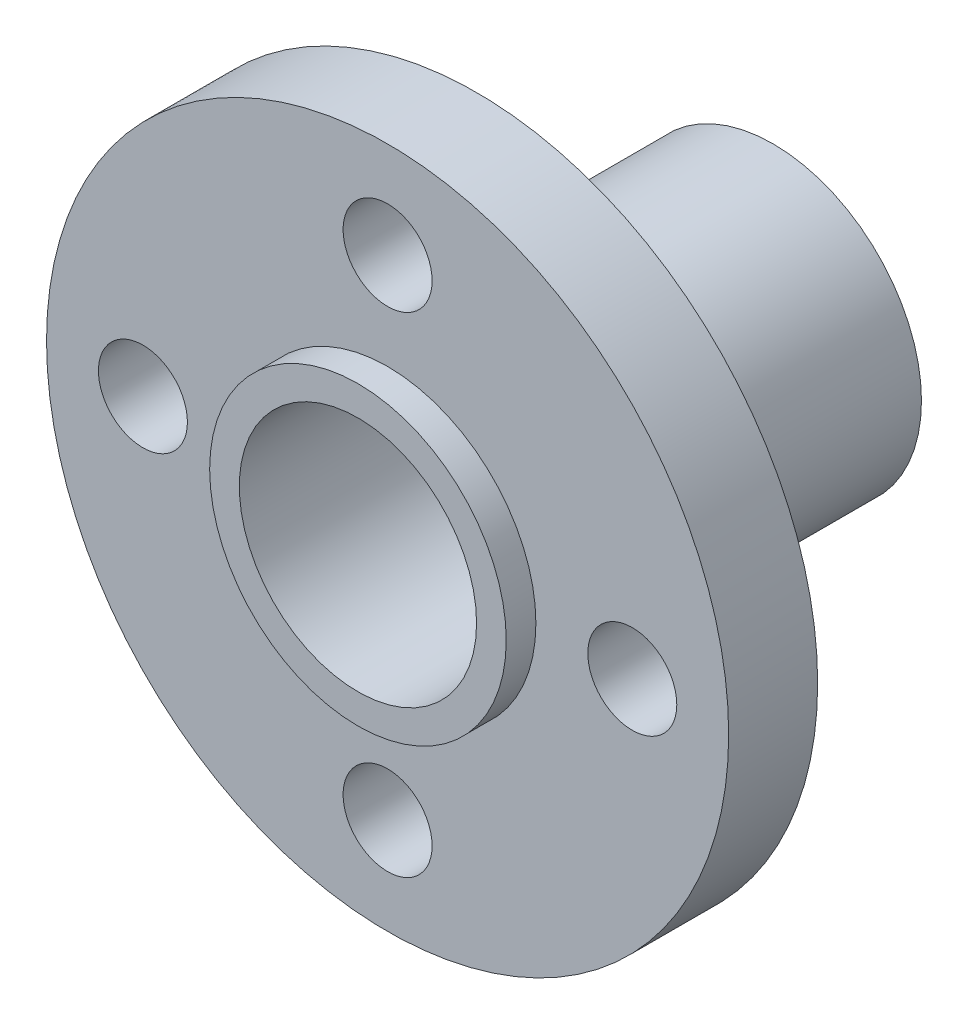
ISO-10303-21;
HEADER;
FILE_DESCRIPTION(('STEP AP214'),'2;1');
FILE_NAME('part.step','',(''),(''),'','','');
FILE_SCHEMA(('AUTOMOTIVE_DESIGN { 1 0 10303 214 1 1 1 1 }'));
ENDSEC;
DATA;
#1=APPLICATION_CONTEXT('core data for automotive mechanical design processes');
#2=APPLICATION_PROTOCOL_DEFINITION('international standard','automotive_design',2000,#1);
#3=PRODUCT_CONTEXT('',#1,'mechanical');
#4=PRODUCT('Part','Part','',(#3));
#5=PRODUCT_RELATED_PRODUCT_CATEGORY('part','',(#4));
#6=PRODUCT_DEFINITION_FORMATION('','',#4);
#7=PRODUCT_DEFINITION_CONTEXT('part definition',#1,'design');
#8=PRODUCT_DEFINITION('design','',#6,#7);
#9=PRODUCT_DEFINITION_SHAPE('','',#8);
#10=(LENGTH_UNIT() NAMED_UNIT(*) SI_UNIT(.MILLI.,.METRE.));
#11=(NAMED_UNIT(*) PLANE_ANGLE_UNIT() SI_UNIT($,.RADIAN.));
#12=(NAMED_UNIT(*) SI_UNIT($,.STERADIAN.) SOLID_ANGLE_UNIT());
#13=UNCERTAINTY_MEASURE_WITH_UNIT(LENGTH_MEASURE(1.E-05),#10,'distance_accuracy_value','');
#14=(GEOMETRIC_REPRESENTATION_CONTEXT(3) GLOBAL_UNCERTAINTY_ASSIGNED_CONTEXT((#13)) GLOBAL_UNIT_ASSIGNED_CONTEXT((#10,
#11,#12)) REPRESENTATION_CONTEXT('',''));
#15=CARTESIAN_POINT('',(0.,0.,0.));
#16=DIRECTION('',(0.,0.,1.));
#17=DIRECTION('',(1.,0.,0.));
#18=AXIS2_PLACEMENT_3D('',#15,#16,#17);
#19=CARTESIAN_POINT('',(0.,0.,3.));
#20=DIRECTION('',(0.,0.,-1.));
#21=DIRECTION('',(-1.,0.,0.));
#22=AXIS2_PLACEMENT_3D('',#19,#20,#21);
#23=CYLINDRICAL_SURFACE('',#22,11.5);
#24=CARTESIAN_POINT('',(0.,0.,3.));
#25=DIRECTION('',(0.,0.,1.));
#26=DIRECTION('',(1.,0.,0.));
#27=AXIS2_PLACEMENT_3D('',#24,#25,#26);
#28=CIRCLE('',#27,11.5);
#29=CARTESIAN_POINT('',(11.5,0.,3.));
#30=VERTEX_POINT('',#29);
#31=EDGE_CURVE('E46',#30,#30,#28,.T.);
#32=ORIENTED_EDGE('',*,*,#31,.F.);
#33=EDGE_LOOP('',(#32));
#34=FACE_BOUND('',#33,.T.);
#35=CARTESIAN_POINT('',(0.,0.,0.));
#36=DIRECTION('',(0.,0.,1.));
#37=DIRECTION('',(1.,0.,0.));
#38=AXIS2_PLACEMENT_3D('',#35,#36,#37);
#39=CIRCLE('',#38,11.5);
#40=CARTESIAN_POINT('',(11.5,0.,0.));
#41=VERTEX_POINT('',#40);
#42=EDGE_CURVE('E51',#41,#41,#39,.T.);
#43=ORIENTED_EDGE('',*,*,#42,.T.);
#44=EDGE_LOOP('',(#43));
#45=FACE_BOUND('',#44,.T.);
#46=ADVANCED_FACE('F39',(#34,#45),#23,.T.);
#47=CARTESIAN_POINT('',(0.,0.,3.));
#48=DIRECTION('',(0.,0.,1.));
#49=DIRECTION('',(1.,0.,0.));
#50=AXIS2_PLACEMENT_3D('',#47,#48,#49);
#51=PLANE('',#50);
#52=CARTESIAN_POINT('',(0.,8.25,3.));
#53=DIRECTION('',(0.,0.,1.));
#54=DIRECTION('',(1.,0.,0.));
#55=AXIS2_PLACEMENT_3D('',#52,#53,#54);
#56=CIRCLE('',#55,1.5);
#57=CARTESIAN_POINT('',(1.5,8.25,3.));
#58=VERTEX_POINT('',#57);
#59=EDGE_CURVE('E66',#58,#58,#56,.T.);
#60=ORIENTED_EDGE('',*,*,#59,.F.);
#61=EDGE_LOOP('',(#60));
#62=FACE_BOUND('',#61,.T.);
#63=CARTESIAN_POINT('',(8.25,0.,3.));
#64=DIRECTION('',(0.,0.,1.));
#65=DIRECTION('',(1.,0.,0.));
#66=AXIS2_PLACEMENT_3D('',#63,#64,#65);
#67=CIRCLE('',#66,1.5);
#68=CARTESIAN_POINT('',(9.75,0.,3.));
#69=VERTEX_POINT('',#68);
#70=EDGE_CURVE('E157',#69,#69,#67,.T.);
#71=ORIENTED_EDGE('',*,*,#70,.F.);
#72=EDGE_LOOP('',(#71));
#73=FACE_BOUND('',#72,.T.);
#74=CARTESIAN_POINT('',(0.,-8.25,3.));
#75=DIRECTION('',(0.,0.,1.));
#76=DIRECTION('',(1.,0.,0.));
#77=AXIS2_PLACEMENT_3D('',#74,#75,#76);
#78=CIRCLE('',#77,1.5);
#79=CARTESIAN_POINT('',(1.5,-8.25,3.));
#80=VERTEX_POINT('',#79);
#81=EDGE_CURVE('E160',#80,#80,#78,.T.);
#82=ORIENTED_EDGE('',*,*,#81,.F.);
#83=EDGE_LOOP('',(#82));
#84=FACE_BOUND('',#83,.T.);
#85=CARTESIAN_POINT('',(-8.25,0.,3.));
#86=DIRECTION('',(0.,0.,1.));
#87=DIRECTION('',(1.,0.,0.));
#88=AXIS2_PLACEMENT_3D('',#85,#86,#87);
#89=CIRCLE('',#88,1.5);
#90=CARTESIAN_POINT('',(-6.75,0.,3.));
#91=VERTEX_POINT('',#90);
#92=EDGE_CURVE('E85',#91,#91,#89,.T.);
#93=ORIENTED_EDGE('',*,*,#92,.F.);
#94=EDGE_LOOP('',(#93));
#95=FACE_BOUND('',#94,.T.);
#96=CARTESIAN_POINT('',(0.,0.,3.));
#97=DIRECTION('',(0.,0.,1.));
#98=DIRECTION('',(1.,0.,0.));
#99=AXIS2_PLACEMENT_3D('',#96,#97,#98);
#100=CIRCLE('',#99,5.);
#101=CARTESIAN_POINT('',(5.,0.,3.));
#102=VERTEX_POINT('',#101);
#103=EDGE_CURVE('E10',#102,#102,#100,.T.);
#104=ORIENTED_EDGE('',*,*,#103,.F.);
#105=EDGE_LOOP('',(#104));
#106=FACE_BOUND('',#105,.T.);
#107=ORIENTED_EDGE('',*,*,#31,.T.);
#108=EDGE_LOOP('',(#107));
#109=FACE_BOUND('',#108,.T.);
#110=ADVANCED_FACE('F111',(#62,#73,#84,#95,#106,#109),#51,.T.);
#111=CARTESIAN_POINT('',(0.,0.,0.));
#112=DIRECTION('',(0.,0.,1.));
#113=DIRECTION('',(1.,0.,0.));
#114=AXIS2_PLACEMENT_3D('',#111,#112,#113);
#115=PLANE('',#114);
#116=CARTESIAN_POINT('',(0.,8.25,0.));
#117=DIRECTION('',(0.,0.,1.));
#118=DIRECTION('',(1.,0.,0.));
#119=AXIS2_PLACEMENT_3D('',#116,#117,#118);
#120=CIRCLE('',#119,1.5);
#121=CARTESIAN_POINT('',(1.5,8.25,0.));
#122=VERTEX_POINT('',#121);
#123=EDGE_CURVE('E42',#122,#122,#120,.T.);
#124=ORIENTED_EDGE('',*,*,#123,.T.);
#125=EDGE_LOOP('',(#124));
#126=FACE_BOUND('',#125,.T.);
#127=CARTESIAN_POINT('',(8.25,0.,0.));
#128=DIRECTION('',(0.,0.,1.));
#129=DIRECTION('',(1.,0.,0.));
#130=AXIS2_PLACEMENT_3D('',#127,#128,#129);
#131=CIRCLE('',#130,1.5);
#132=CARTESIAN_POINT('',(9.75,0.,0.));
#133=VERTEX_POINT('',#132);
#134=EDGE_CURVE('E68',#133,#133,#131,.T.);
#135=ORIENTED_EDGE('',*,*,#134,.T.);
#136=EDGE_LOOP('',(#135));
#137=FACE_BOUND('',#136,.T.);
#138=CARTESIAN_POINT('',(0.,-8.25,0.));
#139=DIRECTION('',(0.,0.,1.));
#140=DIRECTION('',(1.,0.,0.));
#141=AXIS2_PLACEMENT_3D('',#138,#139,#140);
#142=CIRCLE('',#141,1.5);
#143=CARTESIAN_POINT('',(1.5,-8.25,0.));
#144=VERTEX_POINT('',#143);
#145=EDGE_CURVE('E65',#144,#144,#142,.T.);
#146=ORIENTED_EDGE('',*,*,#145,.T.);
#147=EDGE_LOOP('',(#146));
#148=FACE_BOUND('',#147,.T.);
#149=CARTESIAN_POINT('',(-8.25,0.,0.));
#150=DIRECTION('',(0.,0.,1.));
#151=DIRECTION('',(1.,0.,0.));
#152=AXIS2_PLACEMENT_3D('',#149,#150,#151);
#153=CIRCLE('',#152,1.5);
#154=CARTESIAN_POINT('',(-6.75,0.,0.));
#155=VERTEX_POINT('',#154);
#156=EDGE_CURVE('E62',#155,#155,#153,.T.);
#157=ORIENTED_EDGE('',*,*,#156,.T.);
#158=EDGE_LOOP('',(#157));
#159=FACE_BOUND('',#158,.T.);
#160=CARTESIAN_POINT('',(0.,0.,0.));
#161=DIRECTION('',(0.,0.,1.));
#162=DIRECTION('',(1.,0.,0.));
#163=AXIS2_PLACEMENT_3D('',#160,#161,#162);
#164=CIRCLE('',#163,5.);
#165=CARTESIAN_POINT('',(5.,0.,0.));
#166=VERTEX_POINT('',#165);
#167=EDGE_CURVE('E59',#166,#166,#164,.T.);
#168=ORIENTED_EDGE('',*,*,#167,.T.);
#169=EDGE_LOOP('',(#168));
#170=FACE_BOUND('',#169,.T.);
#171=ORIENTED_EDGE('',*,*,#42,.F.);
#172=EDGE_LOOP('',(#171));
#173=FACE_BOUND('',#172,.T.);
#174=ADVANCED_FACE('F108',(#126,#137,#148,#159,#170,#173),#115,.F.);
#175=CARTESIAN_POINT('',(0.,0.,-10.));
#176=DIRECTION('',(0.,0.,1.));
#177=DIRECTION('',(1.,0.,0.));
#178=AXIS2_PLACEMENT_3D('',#175,#176,#177);
#179=CYLINDRICAL_SURFACE('',#178,5.);
#180=CARTESIAN_POINT('',(0.,0.,-10.));
#181=DIRECTION('',(0.,0.,1.));
#182=DIRECTION('',(1.,0.,0.));
#183=AXIS2_PLACEMENT_3D('',#180,#181,#182);
#184=CIRCLE('',#183,5.);
#185=CARTESIAN_POINT('',(5.,0.,-10.));
#186=VERTEX_POINT('',#185);
#187=EDGE_CURVE('E54',#186,#186,#184,.T.);
#188=CARTESIAN_POINT('',(5.,0.,-10.));
#189=CARTESIAN_POINT('',(5.,0.,-9.89583333333333));
#190=CARTESIAN_POINT('',(5.,0.,-9.79166666666667));
#191=CARTESIAN_POINT('',(5.,0.,-9.58333333333333));
#192=CARTESIAN_POINT('',(5.,0.,-9.47916666666667));
#193=CARTESIAN_POINT('',(5.,0.,-9.27083333333333));
#194=CARTESIAN_POINT('',(5.,0.,-9.16666666666667));
#195=CARTESIAN_POINT('',(5.,0.,-8.95833333333333));
#196=CARTESIAN_POINT('',(5.,0.,-8.85416666666667));
#197=CARTESIAN_POINT('',(5.,0.,-8.64583333333333));
#198=CARTESIAN_POINT('',(5.,0.,-8.54166666666667));
#199=CARTESIAN_POINT('',(5.,0.,-8.33333333333333));
#200=CARTESIAN_POINT('',(5.,0.,-8.22916666666667));
#201=CARTESIAN_POINT('',(5.,0.,-8.02083333333333));
#202=CARTESIAN_POINT('',(5.,0.,-7.91666666666667));
#203=CARTESIAN_POINT('',(5.,0.,-7.70833333333333));
#204=CARTESIAN_POINT('',(5.,0.,-7.60416666666667));
#205=CARTESIAN_POINT('',(5.,0.,-7.39583333333333));
#206=CARTESIAN_POINT('',(5.,0.,-7.29166666666667));
#207=CARTESIAN_POINT('',(5.,0.,-7.08333333333333));
#208=CARTESIAN_POINT('',(5.,0.,-6.97916666666667));
#209=CARTESIAN_POINT('',(5.,0.,-6.77083333333333));
#210=CARTESIAN_POINT('',(5.,0.,-6.66666666666667));
#211=CARTESIAN_POINT('',(5.,0.,-6.45833333333333));
#212=CARTESIAN_POINT('',(5.,0.,-6.35416666666667));
#213=CARTESIAN_POINT('',(5.,0.,-6.14583333333333));
#214=CARTESIAN_POINT('',(5.,0.,-6.04166666666667));
#215=CARTESIAN_POINT('',(5.,0.,-5.83333333333333));
#216=CARTESIAN_POINT('',(5.,0.,-5.72916666666667));
#217=CARTESIAN_POINT('',(5.,0.,-5.52083333333333));
#218=CARTESIAN_POINT('',(5.,0.,-5.41666666666667));
#219=CARTESIAN_POINT('',(5.,0.,-5.20833333333333));
#220=CARTESIAN_POINT('',(5.,0.,-5.10416666666667));
#221=CARTESIAN_POINT('',(5.,0.,-4.89583333333333));
#222=CARTESIAN_POINT('',(5.,0.,-4.79166666666667));
#223=CARTESIAN_POINT('',(5.,0.,-4.58333333333333));
#224=CARTESIAN_POINT('',(5.,0.,-4.47916666666667));
#225=CARTESIAN_POINT('',(5.,0.,-4.27083333333333));
#226=CARTESIAN_POINT('',(5.,0.,-4.16666666666667));
#227=CARTESIAN_POINT('',(5.,0.,-3.95833333333333));
#228=CARTESIAN_POINT('',(5.,0.,-3.85416666666667));
#229=CARTESIAN_POINT('',(5.,0.,-3.64583333333333));
#230=CARTESIAN_POINT('',(5.,0.,-3.54166666666667));
#231=CARTESIAN_POINT('',(5.,0.,-3.33333333333333));
#232=CARTESIAN_POINT('',(5.,0.,-3.22916666666667));
#233=CARTESIAN_POINT('',(5.,0.,-3.02083333333333));
#234=CARTESIAN_POINT('',(5.,0.,-2.91666666666667));
#235=CARTESIAN_POINT('',(5.,0.,-2.70833333333333));
#236=CARTESIAN_POINT('',(5.,0.,-2.60416666666667));
#237=CARTESIAN_POINT('',(5.,0.,-2.39583333333333));
#238=CARTESIAN_POINT('',(5.,0.,-2.29166666666667));
#239=CARTESIAN_POINT('',(5.,0.,-2.08333333333333));
#240=CARTESIAN_POINT('',(5.,0.,-1.97916666666667));
#241=CARTESIAN_POINT('',(5.,0.,-1.77083333333334));
#242=CARTESIAN_POINT('',(5.,0.,-1.66666666666667));
#243=CARTESIAN_POINT('',(5.,0.,-1.45833333333333));
#244=CARTESIAN_POINT('',(5.,0.,-1.35416666666667));
#245=CARTESIAN_POINT('',(5.,0.,-1.14583333333333));
#246=CARTESIAN_POINT('',(5.,0.,-1.04166666666667));
#247=CARTESIAN_POINT('',(5.,0.,-0.833333333333336));
#248=CARTESIAN_POINT('',(5.,0.,-0.729166666666669));
#249=CARTESIAN_POINT('',(5.,0.,-0.520833333333335));
#250=CARTESIAN_POINT('',(5.,0.,-0.416666666666669));
#251=CARTESIAN_POINT('',(5.,0.,-0.208333333333335));
#252=CARTESIAN_POINT('',(5.,0.,-0.104166666666669));
#253=CARTESIAN_POINT('',(5.,0.,0.));
#254=B_SPLINE_CURVE_WITH_KNOTS('',3,(#188,#189,#190,#191,#192,#193,#194,#195,#196,#197,#198,
#199,#200,#201,#202,#203,#204,#205,#206,#207,#208,#209,#210,#211,#212,#213,#214,#215,#216,#217,
#218,#219,#220,#221,#222,#223,#224,#225,#226,#227,#228,#229,#230,#231,#232,#233,#234,#235,#236,
#237,#238,#239,#240,#241,#242,#243,#244,#245,#246,#247,#248,#249,#250,#251,#252,#253),
.UNSPECIFIED.,.F.,.F.,(4,2,2,2,2,2,2,2,2,2,2,2,2,2,2,2,2,2,2,2,2,2,2,2,2,2,2,2,2,2,2,2,4),(0.,
0.3125,0.625000000000001,0.937500000000001,1.25,1.5625,1.875,2.1875,2.5,2.8125,3.125,3.4375,
3.75,4.0625,4.375,4.6875,5.,5.3125,5.625,5.9375,6.25,6.5625,6.875,7.1875,7.5,7.8125,8.125,
8.4375,8.75,9.0625,9.375,9.6875,10.),.UNSPECIFIED.);
#255=EDGE_CURVE('BSEAM93',#186,#166,#254,.T.);
#256=ORIENTED_EDGE('',*,*,#187,.T.);
#257=ORIENTED_EDGE('',*,*,#167,.F.);
#258=ORIENTED_EDGE('',*,*,#255,.T.);
#259=ORIENTED_EDGE('',*,*,#255,.F.);
#260=EDGE_LOOP('',(#256,#258,#257,#259));
#261=FACE_BOUND('',#260,.T.);
#262=ADVANCED_FACE('F93',(#261),#179,.T.);
#263=CARTESIAN_POINT('',(0.,0.,-10.));
#264=DIRECTION('',(0.,0.,1.));
#265=DIRECTION('',(1.,0.,0.));
#266=AXIS2_PLACEMENT_3D('',#263,#264,#265);
#267=PLANE('',#266);
#268=CARTESIAN_POINT('',(0.,0.,-10.));
#269=DIRECTION('',(0.,0.,1.));
#270=DIRECTION('',(1.,0.,0.));
#271=AXIS2_PLACEMENT_3D('',#268,#269,#270);
#272=CIRCLE('',#271,4.);
#273=CARTESIAN_POINT('',(4.,0.,-10.));
#274=VERTEX_POINT('',#273);
#275=EDGE_CURVE('E82',#274,#274,#272,.T.);
#276=ORIENTED_EDGE('',*,*,#275,.T.);
#277=EDGE_LOOP('',(#276));
#278=FACE_BOUND('',#277,.T.);
#279=ORIENTED_EDGE('',*,*,#187,.F.);
#280=EDGE_LOOP('',(#279));
#281=FACE_BOUND('',#280,.T.);
#282=ADVANCED_FACE('F96',(#278,#281),#267,.F.);
#283=CARTESIAN_POINT('',(0.,0.,-10.));
#284=DIRECTION('',(0.,0.,1.));
#285=DIRECTION('',(1.,0.,0.));
#286=AXIS2_PLACEMENT_3D('',#283,#284,#285);
#287=CYLINDRICAL_SURFACE('',#286,4.);
#288=CARTESIAN_POINT('',(0.,0.,4.));
#289=DIRECTION('',(0.,0.,1.));
#290=DIRECTION('',(1.,0.,0.));
#291=AXIS2_PLACEMENT_3D('',#288,#289,#290);
#292=CIRCLE('',#291,4.);
#293=CARTESIAN_POINT('',(4.,0.,4.));
#294=VERTEX_POINT('',#293);
#295=EDGE_CURVE('E73',#294,#294,#292,.T.);
#296=CARTESIAN_POINT('',(4.,0.,-10.));
#297=CARTESIAN_POINT('',(4.,0.,-9.85416666666667));
#298=CARTESIAN_POINT('',(4.,0.,-9.70833333333333));
#299=CARTESIAN_POINT('',(4.,0.,-9.41666666666667));
#300=CARTESIAN_POINT('',(4.,0.,-9.27083333333333));
#301=CARTESIAN_POINT('',(4.,0.,-8.97916666666667));
#302=CARTESIAN_POINT('',(4.,0.,-8.83333333333333));
#303=CARTESIAN_POINT('',(4.,0.,-8.54166666666667));
#304=CARTESIAN_POINT('',(4.,0.,-8.39583333333333));
#305=CARTESIAN_POINT('',(4.,0.,-8.10416666666667));
#306=CARTESIAN_POINT('',(4.,0.,-7.95833333333333));
#307=CARTESIAN_POINT('',(4.,0.,-7.66666666666667));
#308=CARTESIAN_POINT('',(4.,0.,-7.52083333333333));
#309=CARTESIAN_POINT('',(4.,0.,-7.22916666666667));
#310=CARTESIAN_POINT('',(4.,0.,-7.08333333333333));
#311=CARTESIAN_POINT('',(4.,0.,-6.79166666666667));
#312=CARTESIAN_POINT('',(4.,0.,-6.64583333333333));
#313=CARTESIAN_POINT('',(4.,0.,-6.35416666666667));
#314=CARTESIAN_POINT('',(4.,0.,-6.20833333333333));
#315=CARTESIAN_POINT('',(4.,0.,-5.91666666666667));
#316=CARTESIAN_POINT('',(4.,0.,-5.77083333333333));
#317=CARTESIAN_POINT('',(4.,0.,-5.47916666666667));
#318=CARTESIAN_POINT('',(4.,0.,-5.33333333333333));
#319=CARTESIAN_POINT('',(4.,0.,-5.04166666666667));
#320=CARTESIAN_POINT('',(4.,0.,-4.89583333333333));
#321=CARTESIAN_POINT('',(4.,0.,-4.60416666666667));
#322=CARTESIAN_POINT('',(4.,0.,-4.45833333333333));
#323=CARTESIAN_POINT('',(4.,0.,-4.16666666666667));
#324=CARTESIAN_POINT('',(4.,0.,-4.02083333333333));
#325=CARTESIAN_POINT('',(4.,0.,-3.72916666666667));
#326=CARTESIAN_POINT('',(4.,0.,-3.58333333333333));
#327=CARTESIAN_POINT('',(4.,0.,-3.29166666666667));
#328=CARTESIAN_POINT('',(4.,0.,-3.14583333333333));
#329=CARTESIAN_POINT('',(4.,0.,-2.85416666666667));
#330=CARTESIAN_POINT('',(4.,0.,-2.70833333333333));
#331=CARTESIAN_POINT('',(4.,0.,-2.41666666666667));
#332=CARTESIAN_POINT('',(4.,0.,-2.27083333333333));
#333=CARTESIAN_POINT('',(4.,0.,-1.97916666666667));
#334=CARTESIAN_POINT('',(4.,0.,-1.83333333333333));
#335=CARTESIAN_POINT('',(4.,0.,-1.54166666666667));
#336=CARTESIAN_POINT('',(4.,0.,-1.39583333333333));
#337=CARTESIAN_POINT('',(4.,0.,-1.10416666666667));
#338=CARTESIAN_POINT('',(4.,0.,-0.958333333333334));
#339=CARTESIAN_POINT('',(4.,0.,-0.666666666666668));
#340=CARTESIAN_POINT('',(4.,0.,-0.520833333333335));
#341=CARTESIAN_POINT('',(4.,0.,-0.229166666666669));
#342=CARTESIAN_POINT('',(4.,0.,-0.0833333333333351));
#343=CARTESIAN_POINT('',(4.,0.,0.208333333333332));
#344=CARTESIAN_POINT('',(4.,0.,0.354166666666665));
#345=CARTESIAN_POINT('',(4.,0.,0.645833333333332));
#346=CARTESIAN_POINT('',(4.,0.,0.791666666666666));
#347=CARTESIAN_POINT('',(4.,0.,1.08333333333333));
#348=CARTESIAN_POINT('',(4.,0.,1.22916666666667));
#349=CARTESIAN_POINT('',(4.,0.,1.52083333333333));
#350=CARTESIAN_POINT('',(4.,0.,1.66666666666667));
#351=CARTESIAN_POINT('',(4.,0.,1.95833333333333));
#352=CARTESIAN_POINT('',(4.,0.,2.10416666666667));
#353=CARTESIAN_POINT('',(4.,0.,2.39583333333333));
#354=CARTESIAN_POINT('',(4.,0.,2.54166666666667));
#355=CARTESIAN_POINT('',(4.,0.,2.83333333333333));
#356=CARTESIAN_POINT('',(4.,0.,2.97916666666666));
#357=CARTESIAN_POINT('',(4.,0.,3.27083333333333));
#358=CARTESIAN_POINT('',(4.,0.,3.41666666666666));
#359=CARTESIAN_POINT('',(4.,0.,3.70833333333333));
#360=CARTESIAN_POINT('',(4.,0.,3.85416666666667));
#361=CARTESIAN_POINT('',(4.,0.,4.));
#362=B_SPLINE_CURVE_WITH_KNOTS('',3,(#296,#297,#298,#299,#300,#301,#302,#303,#304,#305,#306,
#307,#308,#309,#310,#311,#312,#313,#314,#315,#316,#317,#318,#319,#320,#321,#322,#323,#324,#325,
#326,#327,#328,#329,#330,#331,#332,#333,#334,#335,#336,#337,#338,#339,#340,#341,#342,#343,#344,
#345,#346,#347,#348,#349,#350,#351,#352,#353,#354,#355,#356,#357,#358,#359,#360,#361),
.UNSPECIFIED.,.F.,.F.,(4,2,2,2,2,2,2,2,2,2,2,2,2,2,2,2,2,2,2,2,2,2,2,2,2,2,2,2,2,2,2,2,4),(0.,
0.437499999999999,0.874999999999999,1.3125,1.75,2.1875,2.625,3.0625,3.5,3.9375,4.375,4.8125,
5.25,5.6875,6.125,6.5625,7.,7.4375,7.875,8.3125,8.75,9.1875,9.625,10.0625,10.5,10.9375,11.375,
11.8125,12.25,12.6875,13.125,13.5625,14.),.UNSPECIFIED.);
#363=EDGE_CURVE('BSEAM98',#274,#294,#362,.T.);
#364=ORIENTED_EDGE('',*,*,#275,.F.);
#365=ORIENTED_EDGE('',*,*,#295,.T.);
#366=ORIENTED_EDGE('',*,*,#363,.T.);
#367=ORIENTED_EDGE('',*,*,#363,.F.);
#368=EDGE_LOOP('',(#364,#366,#365,#367));
#369=FACE_BOUND('',#368,.T.);
#370=ADVANCED_FACE('F98',(#369),#287,.F.);
#371=CARTESIAN_POINT('',(0.,0.,4.));
#372=DIRECTION('',(0.,0.,1.));
#373=DIRECTION('',(1.,0.,0.));
#374=AXIS2_PLACEMENT_3D('',#371,#372,#373);
#375=CIRCLE('',#374,5.);
#376=CARTESIAN_POINT('',(5.,0.,4.));
#377=VERTEX_POINT('',#376);
#378=EDGE_CURVE('E77',#377,#377,#375,.T.);
#379=CARTESIAN_POINT('',(5.,0.,3.));
#380=CARTESIAN_POINT('',(5.,0.,3.01041666666666));
#381=CARTESIAN_POINT('',(5.,0.,3.02083333333333));
#382=CARTESIAN_POINT('',(5.,0.,3.04166666666666));
#383=CARTESIAN_POINT('',(5.,0.,3.05208333333333));
#384=CARTESIAN_POINT('',(5.,0.,3.07291666666666));
#385=CARTESIAN_POINT('',(5.,0.,3.08333333333333));
#386=CARTESIAN_POINT('',(5.,0.,3.10416666666666));
#387=CARTESIAN_POINT('',(5.,0.,3.11458333333333));
#388=CARTESIAN_POINT('',(5.,0.,3.13541666666666));
#389=CARTESIAN_POINT('',(5.,0.,3.14583333333333));
#390=CARTESIAN_POINT('',(5.,0.,3.16666666666666));
#391=CARTESIAN_POINT('',(5.,0.,3.17708333333333));
#392=CARTESIAN_POINT('',(5.,0.,3.19791666666666));
#393=CARTESIAN_POINT('',(5.,0.,3.20833333333333));
#394=CARTESIAN_POINT('',(5.,0.,3.22916666666666));
#395=CARTESIAN_POINT('',(5.,0.,3.23958333333333));
#396=CARTESIAN_POINT('',(5.,0.,3.26041666666666));
#397=CARTESIAN_POINT('',(5.,0.,3.27083333333333));
#398=CARTESIAN_POINT('',(5.,0.,3.29166666666666));
#399=CARTESIAN_POINT('',(5.,0.,3.30208333333333));
#400=CARTESIAN_POINT('',(5.,0.,3.32291666666666));
#401=CARTESIAN_POINT('',(5.,0.,3.33333333333333));
#402=CARTESIAN_POINT('',(5.,0.,3.35416666666666));
#403=CARTESIAN_POINT('',(5.,0.,3.36458333333333));
#404=CARTESIAN_POINT('',(5.,0.,3.38541666666666));
#405=CARTESIAN_POINT('',(5.,0.,3.39583333333333));
#406=CARTESIAN_POINT('',(5.,0.,3.41666666666666));
#407=CARTESIAN_POINT('',(5.,0.,3.42708333333333));
#408=CARTESIAN_POINT('',(5.,0.,3.44791666666666));
#409=CARTESIAN_POINT('',(5.,0.,3.45833333333333));
#410=CARTESIAN_POINT('',(5.,0.,3.47916666666666));
#411=CARTESIAN_POINT('',(5.,0.,3.48958333333333));
#412=CARTESIAN_POINT('',(5.,0.,3.51041666666666));
#413=CARTESIAN_POINT('',(5.,0.,3.52083333333333));
#414=CARTESIAN_POINT('',(5.,0.,3.54166666666666));
#415=CARTESIAN_POINT('',(5.,0.,3.55208333333333));
#416=CARTESIAN_POINT('',(5.,0.,3.57291666666666));
#417=CARTESIAN_POINT('',(5.,0.,3.58333333333333));
#418=CARTESIAN_POINT('',(5.,0.,3.60416666666666));
#419=CARTESIAN_POINT('',(5.,0.,3.61458333333333));
#420=CARTESIAN_POINT('',(5.,0.,3.63541666666666));
#421=CARTESIAN_POINT('',(5.,0.,3.64583333333333));
#422=CARTESIAN_POINT('',(5.,0.,3.66666666666666));
#423=CARTESIAN_POINT('',(5.,0.,3.67708333333333));
#424=CARTESIAN_POINT('',(5.,0.,3.69791666666666));
#425=CARTESIAN_POINT('',(5.,0.,3.70833333333333));
#426=CARTESIAN_POINT('',(5.,0.,3.72916666666666));
#427=CARTESIAN_POINT('',(5.,0.,3.73958333333333));
#428=CARTESIAN_POINT('',(5.,0.,3.76041666666666));
#429=CARTESIAN_POINT('',(5.,0.,3.77083333333333));
#430=CARTESIAN_POINT('',(5.,0.,3.79166666666667));
#431=CARTESIAN_POINT('',(5.,0.,3.80208333333333));
#432=CARTESIAN_POINT('',(5.,0.,3.82291666666667));
#433=CARTESIAN_POINT('',(5.,0.,3.83333333333333));
#434=CARTESIAN_POINT('',(5.,0.,3.85416666666667));
#435=CARTESIAN_POINT('',(5.,0.,3.86458333333333));
#436=CARTESIAN_POINT('',(5.,0.,3.88541666666667));
#437=CARTESIAN_POINT('',(5.,0.,3.89583333333333));
#438=CARTESIAN_POINT('',(5.,0.,3.91666666666666));
#439=CARTESIAN_POINT('',(5.,0.,3.92708333333333));
#440=CARTESIAN_POINT('',(5.,0.,3.94791666666666));
#441=CARTESIAN_POINT('',(5.,0.,3.95833333333333));
#442=CARTESIAN_POINT('',(5.,0.,3.97916666666666));
#443=CARTESIAN_POINT('',(5.,0.,3.98958333333333));
#444=CARTESIAN_POINT('',(5.,0.,4.));
#445=B_SPLINE_CURVE_WITH_KNOTS('',3,(#379,#380,#381,#382,#383,#384,#385,#386,#387,#388,#389,
#390,#391,#392,#393,#394,#395,#396,#397,#398,#399,#400,#401,#402,#403,#404,#405,#406,#407,#408,
#409,#410,#411,#412,#413,#414,#415,#416,#417,#418,#419,#420,#421,#422,#423,#424,#425,#426,#427,
#428,#429,#430,#431,#432,#433,#434,#435,#436,#437,#438,#439,#440,#441,#442,#443,#444),
.UNSPECIFIED.,.F.,.F.,(4,2,2,2,2,2,2,2,2,2,2,2,2,2,2,2,2,2,2,2,2,2,2,2,2,2,2,2,2,2,2,2,4),(0.,
0.03125,0.0625000000000001,0.0937500000000001,0.125,0.15625,0.1875,0.21875,0.25,0.28125,0.3125,
0.34375,0.375,0.40625,0.4375,0.46875,0.5,0.53125,0.5625,0.593750000000001,0.625000000000001,
0.656250000000001,0.687500000000001,0.718750000000001,0.750000000000001,0.781250000000001,
0.812500000000001,0.843750000000001,0.875000000000001,0.906250000000001,0.937500000000001,
0.968750000000001,1.),.UNSPECIFIED.);
#446=EDGE_CURVE('BSEAM105',#102,#377,#445,.T.);
#447=ORIENTED_EDGE('',*,*,#103,.T.);
#448=ORIENTED_EDGE('',*,*,#378,.F.);
#449=ORIENTED_EDGE('',*,*,#446,.T.);
#450=ORIENTED_EDGE('',*,*,#446,.F.);
#451=EDGE_LOOP('',(#447,#449,#448,#450));
#452=FACE_BOUND('',#451,.T.);
#453=ADVANCED_FACE('F105',(#452),#179,.T.);
#454=CARTESIAN_POINT('',(0.,0.,4.));
#455=DIRECTION('',(0.,0.,1.));
#456=DIRECTION('',(1.,0.,0.));
#457=AXIS2_PLACEMENT_3D('',#454,#455,#456);
#458=PLANE('',#457);
#459=ORIENTED_EDGE('',*,*,#378,.T.);
#460=EDGE_LOOP('',(#459));
#461=FACE_BOUND('',#460,.T.);
#462=ORIENTED_EDGE('',*,*,#295,.F.);
#463=EDGE_LOOP('',(#462));
#464=FACE_BOUND('',#463,.T.);
#465=ADVANCED_FACE('F126',(#461,#464),#458,.T.);
#466=CARTESIAN_POINT('',(-8.25,0.,-2.));
#467=DIRECTION('',(0.,0.,1.));
#468=DIRECTION('',(1.,0.,0.));
#469=AXIS2_PLACEMENT_3D('',#466,#467,#468);
#470=CYLINDRICAL_SURFACE('',#469,1.5);
#471=ORIENTED_EDGE('',*,*,#92,.T.);
#472=EDGE_LOOP('',(#471));
#473=FACE_BOUND('',#472,.T.);
#474=ORIENTED_EDGE('',*,*,#156,.F.);
#475=EDGE_LOOP('',(#474));
#476=FACE_BOUND('',#475,.T.);
#477=ADVANCED_FACE('F130',(#473,#476),#470,.F.);
#478=CARTESIAN_POINT('',(0.,-8.25,-2.));
#479=DIRECTION('',(0.,0.,1.));
#480=DIRECTION('',(1.,0.,0.));
#481=AXIS2_PLACEMENT_3D('',#478,#479,#480);
#482=CYLINDRICAL_SURFACE('',#481,1.5);
#483=ORIENTED_EDGE('',*,*,#81,.T.);
#484=EDGE_LOOP('',(#483));
#485=FACE_BOUND('',#484,.T.);
#486=ORIENTED_EDGE('',*,*,#145,.F.);
#487=EDGE_LOOP('',(#486));
#488=FACE_BOUND('',#487,.T.);
#489=ADVANCED_FACE('F138',(#485,#488),#482,.F.);
#490=CARTESIAN_POINT('',(8.25,0.,-2.));
#491=DIRECTION('',(0.,0.,1.));
#492=DIRECTION('',(1.,0.,0.));
#493=AXIS2_PLACEMENT_3D('',#490,#491,#492);
#494=CYLINDRICAL_SURFACE('',#493,1.5);
#495=ORIENTED_EDGE('',*,*,#70,.T.);
#496=EDGE_LOOP('',(#495));
#497=FACE_BOUND('',#496,.T.);
#498=ORIENTED_EDGE('',*,*,#134,.F.);
#499=EDGE_LOOP('',(#498));
#500=FACE_BOUND('',#499,.T.);
#501=ADVANCED_FACE('F144',(#497,#500),#494,.F.);
#502=CARTESIAN_POINT('',(0.,8.25,-2.));
#503=DIRECTION('',(0.,0.,1.));
#504=DIRECTION('',(1.,0.,0.));
#505=AXIS2_PLACEMENT_3D('',#502,#503,#504);
#506=CYLINDRICAL_SURFACE('',#505,1.5);
#507=ORIENTED_EDGE('',*,*,#59,.T.);
#508=EDGE_LOOP('',(#507));
#509=FACE_BOUND('',#508,.T.);
#510=ORIENTED_EDGE('',*,*,#123,.F.);
#511=EDGE_LOOP('',(#510));
#512=FACE_BOUND('',#511,.T.);
#513=ADVANCED_FACE('F148',(#509,#512),#506,.F.);
#514=CLOSED_SHELL('',(#46,#110,#174,#262,#282,#370,#453,#465,#477,#489,#501,#513));
#515=MANIFOLD_SOLID_BREP('B2',#514);
#516=ADVANCED_BREP_SHAPE_REPRESENTATION('',(#18,#515),#14);
#517=SHAPE_DEFINITION_REPRESENTATION(#9,#516);
ENDSEC;
END-ISO-10303-21;
